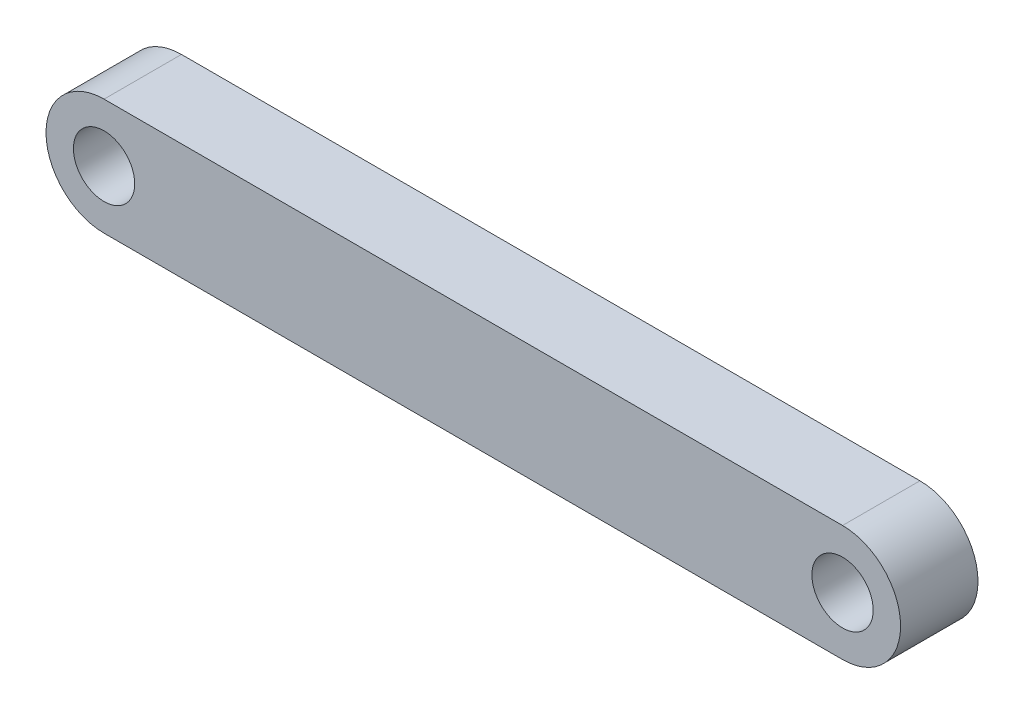
ISO-10303-21;
HEADER;
FILE_DESCRIPTION(('STEP AP214'),'2;1');
FILE_NAME('part.step','',(''),(''),'','','');
FILE_SCHEMA(('AUTOMOTIVE_DESIGN { 1 0 10303 214 1 1 1 1 }'));
ENDSEC;
DATA;
#1=APPLICATION_CONTEXT('core data for automotive mechanical design processes');
#2=APPLICATION_PROTOCOL_DEFINITION('international standard','automotive_design',2000,#1);
#3=PRODUCT_CONTEXT('',#1,'mechanical');
#4=PRODUCT('Part','Part','',(#3));
#5=PRODUCT_RELATED_PRODUCT_CATEGORY('part','',(#4));
#6=PRODUCT_DEFINITION_FORMATION('','',#4);
#7=PRODUCT_DEFINITION_CONTEXT('part definition',#1,'design');
#8=PRODUCT_DEFINITION('design','',#6,#7);
#9=PRODUCT_DEFINITION_SHAPE('','',#8);
#10=(LENGTH_UNIT() NAMED_UNIT(*) SI_UNIT(.MILLI.,.METRE.));
#11=(NAMED_UNIT(*) PLANE_ANGLE_UNIT() SI_UNIT($,.RADIAN.));
#12=(NAMED_UNIT(*) SI_UNIT($,.STERADIAN.) SOLID_ANGLE_UNIT());
#13=UNCERTAINTY_MEASURE_WITH_UNIT(LENGTH_MEASURE(1.E-05),#10,'distance_accuracy_value','');
#14=(GEOMETRIC_REPRESENTATION_CONTEXT(3) GLOBAL_UNCERTAINTY_ASSIGNED_CONTEXT((#13)) GLOBAL_UNIT_ASSIGNED_CONTEXT((#10,
#11,#12)) REPRESENTATION_CONTEXT('',''));
#15=CARTESIAN_POINT('',(0.,0.,0.));
#16=DIRECTION('',(0.,0.,1.));
#17=DIRECTION('',(1.,0.,0.));
#18=AXIS2_PLACEMENT_3D('',#15,#16,#17);
#19=CARTESIAN_POINT('',(-4.8895,307.984144869549,6.35));
#20=DIRECTION('',(0.,0.,1.));
#21=DIRECTION('',(1.,0.,0.));
#22=AXIS2_PLACEMENT_3D('',#19,#20,#21);
#23=PLANE('',#22);
#24=CARTESIAN_POINT('',(55.6895,307.984144869549,6.35));
#25=DIRECTION('',(0.,0.,1.));
#26=DIRECTION('',(1.,0.,0.));
#27=AXIS2_PLACEMENT_3D('',#24,#25,#26);
#28=CIRCLE('',#27,2.5146);
#29=CARTESIAN_POINT('',(58.2041,307.984144869549,6.35));
#30=VERTEX_POINT('',#29);
#31=EDGE_CURVE('E104',#30,#30,#28,.T.);
#32=ORIENTED_EDGE('',*,*,#31,.F.);
#33=EDGE_LOOP('',(#32));
#34=FACE_BOUND('',#33,.T.);
#35=CARTESIAN_POINT('',(-4.8895,307.984144869549,6.35));
#36=DIRECTION('',(0.,0.,1.));
#37=DIRECTION('',(1.,0.,0.));
#38=AXIS2_PLACEMENT_3D('',#35,#36,#37);
#39=CIRCLE('',#38,4.7625);
#40=CARTESIAN_POINT('',(-4.8895,312.746644869549,6.35));
#41=VERTEX_POINT('',#40);
#42=CARTESIAN_POINT('',(-4.8895,303.221644869549,6.35));
#43=VERTEX_POINT('',#42);
#44=EDGE_CURVE('E89',#41,#43,#39,.T.);
#45=ORIENTED_EDGE('',*,*,#44,.T.);
#46=DIRECTION('',(1.,0.,0.));
#47=VECTOR('',#46,1.);
#48=CARTESIAN_POINT('',(-4.8895,303.221644869549,6.35));
#49=LINE('',#48,#47);
#50=CARTESIAN_POINT('',(55.6895,303.221644869549,6.35));
#51=VERTEX_POINT('',#50);
#52=EDGE_CURVE('E84',#43,#51,#49,.T.);
#53=ORIENTED_EDGE('',*,*,#52,.T.);
#54=CARTESIAN_POINT('',(55.6895,307.984144869549,6.35));
#55=DIRECTION('',(0.,0.,1.));
#56=DIRECTION('',(1.,0.,0.));
#57=AXIS2_PLACEMENT_3D('',#54,#55,#56);
#58=CIRCLE('',#57,4.7625);
#59=CARTESIAN_POINT('',(55.6895,312.746644869549,6.35));
#60=VERTEX_POINT('',#59);
#61=EDGE_CURVE('E87',#51,#60,#58,.T.);
#62=ORIENTED_EDGE('',*,*,#61,.T.);
#63=DIRECTION('',(-1.,0.,0.));
#64=VECTOR('',#63,1.);
#65=CARTESIAN_POINT('',(-4.8895,312.746644869549,6.35));
#66=LINE('',#65,#64);
#67=EDGE_CURVE('E54',#60,#41,#66,.T.);
#68=ORIENTED_EDGE('',*,*,#67,.T.);
#69=EDGE_LOOP('',(#45,#53,#62,#68));
#70=FACE_BOUND('',#69,.T.);
#71=CARTESIAN_POINT('',(-4.8895,307.984144869549,6.35));
#72=DIRECTION('',(0.,0.,1.));
#73=DIRECTION('',(1.,0.,0.));
#74=AXIS2_PLACEMENT_3D('',#71,#72,#73);
#75=CIRCLE('',#74,2.51460000000001);
#76=CARTESIAN_POINT('',(-2.37489999999999,307.984144869549,6.35));
#77=VERTEX_POINT('',#76);
#78=EDGE_CURVE('E119',#77,#77,#75,.T.);
#79=ORIENTED_EDGE('',*,*,#78,.F.);
#80=EDGE_LOOP('',(#79));
#81=FACE_BOUND('',#80,.T.);
#82=ADVANCED_FACE('F37',(#34,#70,#81),#23,.T.);
#83=CARTESIAN_POINT('',(-4.8895,307.984144869549,0.));
#84=DIRECTION('',(0.,0.,1.));
#85=DIRECTION('',(1.,0.,0.));
#86=AXIS2_PLACEMENT_3D('',#83,#84,#85);
#87=PLANE('',#86);
#88=CARTESIAN_POINT('',(-4.8895,307.984144869549,0.));
#89=DIRECTION('',(0.,0.,1.));
#90=DIRECTION('',(1.,0.,0.));
#91=AXIS2_PLACEMENT_3D('',#88,#89,#90);
#92=CIRCLE('',#91,4.7625);
#93=CARTESIAN_POINT('',(-4.8895,312.746644869549,0.));
#94=VERTEX_POINT('',#93);
#95=CARTESIAN_POINT('',(-4.8895,303.221644869549,0.));
#96=VERTEX_POINT('',#95);
#97=EDGE_CURVE('E101',#94,#96,#92,.T.);
#98=ORIENTED_EDGE('',*,*,#97,.F.);
#99=DIRECTION('',(-1.,0.,0.));
#100=VECTOR('',#99,1.);
#101=CARTESIAN_POINT('',(-4.8895,312.746644869549,0.));
#102=LINE('',#101,#100);
#103=CARTESIAN_POINT('',(55.6895,312.746644869549,0.));
#104=VERTEX_POINT('',#103);
#105=EDGE_CURVE('E77',#104,#94,#102,.T.);
#106=ORIENTED_EDGE('',*,*,#105,.F.);
#107=CARTESIAN_POINT('',(55.6895,307.984144869549,0.));
#108=DIRECTION('',(0.,0.,1.));
#109=DIRECTION('',(1.,0.,0.));
#110=AXIS2_PLACEMENT_3D('',#107,#108,#109);
#111=CIRCLE('',#110,4.7625);
#112=CARTESIAN_POINT('',(55.6895,303.221644869549,0.));
#113=VERTEX_POINT('',#112);
#114=EDGE_CURVE('E71',#113,#104,#111,.T.);
#115=ORIENTED_EDGE('',*,*,#114,.F.);
#116=DIRECTION('',(1.,0.,0.));
#117=VECTOR('',#116,1.);
#118=CARTESIAN_POINT('',(-4.8895,303.221644869549,0.));
#119=LINE('',#118,#117);
#120=EDGE_CURVE('E93',#96,#113,#119,.T.);
#121=ORIENTED_EDGE('',*,*,#120,.F.);
#122=EDGE_LOOP('',(#98,#106,#115,#121));
#123=FACE_BOUND('',#122,.T.);
#124=CARTESIAN_POINT('',(55.6895,307.984144869549,0.));
#125=DIRECTION('',(0.,0.,1.));
#126=DIRECTION('',(1.,0.,0.));
#127=AXIS2_PLACEMENT_3D('',#124,#125,#126);
#128=CIRCLE('',#127,2.5146);
#129=CARTESIAN_POINT('',(58.2041,307.984144869549,0.));
#130=VERTEX_POINT('',#129);
#131=EDGE_CURVE('E116',#130,#130,#128,.T.);
#132=ORIENTED_EDGE('',*,*,#131,.T.);
#133=EDGE_LOOP('',(#132));
#134=FACE_BOUND('',#133,.T.);
#135=CARTESIAN_POINT('',(-4.8895,307.984144869549,0.));
#136=DIRECTION('',(0.,0.,1.));
#137=DIRECTION('',(1.,0.,0.));
#138=AXIS2_PLACEMENT_3D('',#135,#136,#137);
#139=CIRCLE('',#138,2.51460000000001);
#140=CARTESIAN_POINT('',(-2.37489999999999,307.984144869549,0.));
#141=VERTEX_POINT('',#140);
#142=EDGE_CURVE('E122',#141,#141,#139,.T.);
#143=ORIENTED_EDGE('',*,*,#142,.T.);
#144=EDGE_LOOP('',(#143));
#145=FACE_BOUND('',#144,.T.);
#146=ADVANCED_FACE('F112',(#123,#134,#145),#87,.F.);
#147=CARTESIAN_POINT('',(-4.8895,307.984144869549,6.35));
#148=DIRECTION('',(0.,0.,-1.));
#149=DIRECTION('',(-1.,0.,0.));
#150=AXIS2_PLACEMENT_3D('',#147,#148,#149);
#151=CYLINDRICAL_SURFACE('',#150,4.7625);
#152=ORIENTED_EDGE('',*,*,#97,.T.);
#153=DIRECTION('',(0.,0.,-1.));
#154=VECTOR('',#153,1.);
#155=CARTESIAN_POINT('',(-4.8895,303.221644869549,6.35));
#156=LINE('',#155,#154);
#157=EDGE_CURVE('E11',#43,#96,#156,.T.);
#158=ORIENTED_EDGE('',*,*,#157,.F.);
#159=ORIENTED_EDGE('',*,*,#44,.F.);
#160=DIRECTION('',(0.,0.,-1.));
#161=VECTOR('',#160,1.);
#162=CARTESIAN_POINT('',(-4.8895,312.746644869549,6.35));
#163=LINE('',#162,#161);
#164=EDGE_CURVE('E97',#41,#94,#163,.T.);
#165=ORIENTED_EDGE('',*,*,#164,.T.);
#166=EDGE_LOOP('',(#152,#158,#159,#165));
#167=FACE_BOUND('',#166,.T.);
#168=ADVANCED_FACE('F39',(#167),#151,.T.);
#169=CARTESIAN_POINT('',(-4.8895,303.221644869549,6.35));
#170=DIRECTION('',(0.,1.,0.));
#171=DIRECTION('',(0.,0.,1.));
#172=AXIS2_PLACEMENT_3D('',#169,#170,#171);
#173=PLANE('',#172);
#174=ORIENTED_EDGE('',*,*,#120,.T.);
#175=DIRECTION('',(0.,0.,-1.));
#176=VECTOR('',#175,1.);
#177=CARTESIAN_POINT('',(55.6895,303.221644869549,6.35));
#178=LINE('',#177,#176);
#179=EDGE_CURVE('E46',#51,#113,#178,.T.);
#180=ORIENTED_EDGE('',*,*,#179,.F.);
#181=ORIENTED_EDGE('',*,*,#52,.F.);
#182=ORIENTED_EDGE('',*,*,#157,.T.);
#183=EDGE_LOOP('',(#174,#180,#181,#182));
#184=FACE_BOUND('',#183,.T.);
#185=ADVANCED_FACE('F92',(#184),#173,.F.);
#186=CARTESIAN_POINT('',(55.6895,307.984144869549,6.35));
#187=DIRECTION('',(0.,0.,-1.));
#188=DIRECTION('',(-1.,0.,0.));
#189=AXIS2_PLACEMENT_3D('',#186,#187,#188);
#190=CYLINDRICAL_SURFACE('',#189,4.7625);
#191=ORIENTED_EDGE('',*,*,#114,.T.);
#192=DIRECTION('',(0.,0.,-1.));
#193=VECTOR('',#192,1.);
#194=CARTESIAN_POINT('',(55.6895,312.746644869549,6.35));
#195=LINE('',#194,#193);
#196=EDGE_CURVE('E94',#60,#104,#195,.T.);
#197=ORIENTED_EDGE('',*,*,#196,.F.);
#198=ORIENTED_EDGE('',*,*,#61,.F.);
#199=ORIENTED_EDGE('',*,*,#179,.T.);
#200=EDGE_LOOP('',(#191,#197,#198,#199));
#201=FACE_BOUND('',#200,.T.);
#202=ADVANCED_FACE('F95',(#201),#190,.T.);
#203=CARTESIAN_POINT('',(-4.8895,312.746644869549,6.35));
#204=DIRECTION('',(0.,-1.,0.));
#205=DIRECTION('',(0.,0.,-1.));
#206=AXIS2_PLACEMENT_3D('',#203,#204,#205);
#207=PLANE('',#206);
#208=ORIENTED_EDGE('',*,*,#105,.T.);
#209=ORIENTED_EDGE('',*,*,#164,.F.);
#210=ORIENTED_EDGE('',*,*,#67,.F.);
#211=ORIENTED_EDGE('',*,*,#196,.T.);
#212=EDGE_LOOP('',(#208,#209,#210,#211));
#213=FACE_BOUND('',#212,.T.);
#214=ADVANCED_FACE('F109',(#213),#207,.F.);
#215=CARTESIAN_POINT('',(55.6895,307.984144869549,6.35));
#216=DIRECTION('',(0.,0.,-1.));
#217=DIRECTION('',(-1.,0.,0.));
#218=AXIS2_PLACEMENT_3D('',#215,#216,#217);
#219=CYLINDRICAL_SURFACE('',#218,2.5146);
#220=ORIENTED_EDGE('',*,*,#31,.T.);
#221=EDGE_LOOP('',(#220));
#222=FACE_BOUND('',#221,.T.);
#223=ORIENTED_EDGE('',*,*,#131,.F.);
#224=EDGE_LOOP('',(#223));
#225=FACE_BOUND('',#224,.T.);
#226=ADVANCED_FACE('F139',(#222,#225),#219,.F.);
#227=CARTESIAN_POINT('',(-4.8895,307.984144869549,6.35));
#228=DIRECTION('',(0.,0.,-1.));
#229=DIRECTION('',(-1.,0.,0.));
#230=AXIS2_PLACEMENT_3D('',#227,#228,#229);
#231=CYLINDRICAL_SURFACE('',#230,2.51460000000001);
#232=ORIENTED_EDGE('',*,*,#78,.T.);
#233=EDGE_LOOP('',(#232));
#234=FACE_BOUND('',#233,.T.);
#235=ORIENTED_EDGE('',*,*,#142,.F.);
#236=EDGE_LOOP('',(#235));
#237=FACE_BOUND('',#236,.T.);
#238=ADVANCED_FACE('F128',(#234,#237),#231,.F.);
#239=CLOSED_SHELL('',(#82,#146,#168,#185,#202,#214,#226,#238));
#240=MANIFOLD_SOLID_BREP('B2',#239);
#241=ADVANCED_BREP_SHAPE_REPRESENTATION('',(#18,#240),#14);
#242=SHAPE_DEFINITION_REPRESENTATION(#9,#241);
ENDSEC;
END-ISO-10303-21;
